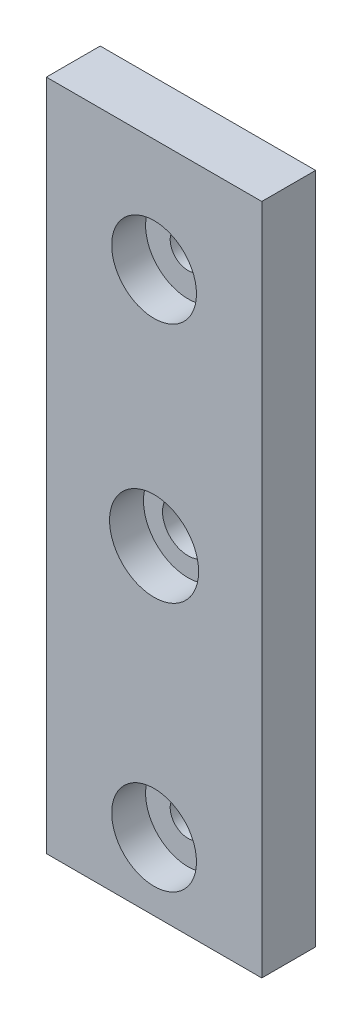
ISO-10303-21;
HEADER;
FILE_DESCRIPTION(('STEP AP214'),'2;1');
FILE_NAME('part.step','',(''),(''),'','','');
FILE_SCHEMA(('AUTOMOTIVE_DESIGN { 1 0 10303 214 1 1 1 1 }'));
ENDSEC;
DATA;
#1=APPLICATION_CONTEXT('core data for automotive mechanical design processes');
#2=APPLICATION_PROTOCOL_DEFINITION('international standard','automotive_design',2000,#1);
#3=PRODUCT_CONTEXT('',#1,'mechanical');
#4=PRODUCT('Part','Part','',(#3));
#5=PRODUCT_RELATED_PRODUCT_CATEGORY('part','',(#4));
#6=PRODUCT_DEFINITION_FORMATION('','',#4);
#7=PRODUCT_DEFINITION_CONTEXT('part definition',#1,'design');
#8=PRODUCT_DEFINITION('design','',#6,#7);
#9=PRODUCT_DEFINITION_SHAPE('','',#8);
#10=(LENGTH_UNIT() NAMED_UNIT(*) SI_UNIT(.MILLI.,.METRE.));
#11=(NAMED_UNIT(*) PLANE_ANGLE_UNIT() SI_UNIT($,.RADIAN.));
#12=(NAMED_UNIT(*) SI_UNIT($,.STERADIAN.) SOLID_ANGLE_UNIT());
#13=UNCERTAINTY_MEASURE_WITH_UNIT(LENGTH_MEASURE(1.E-05),#10,'distance_accuracy_value','');
#14=(GEOMETRIC_REPRESENTATION_CONTEXT(3) GLOBAL_UNCERTAINTY_ASSIGNED_CONTEXT((#13)) GLOBAL_UNIT_ASSIGNED_CONTEXT((#10,
#11,#12)) REPRESENTATION_CONTEXT('',''));
#15=CARTESIAN_POINT('',(0.,0.,0.));
#16=DIRECTION('',(0.,0.,1.));
#17=DIRECTION('',(1.,0.,0.));
#18=AXIS2_PLACEMENT_3D('',#15,#16,#17);
#19=CARTESIAN_POINT('',(32.4561419954302,53.471,-3.23368859390726));
#20=DIRECTION('',(0.,0.,1.));
#21=DIRECTION('',(1.,0.,0.));
#22=AXIS2_PLACEMENT_3D('',#19,#20,#21);
#23=CYLINDRICAL_SURFACE('',#22,5.25);
#24=CARTESIAN_POINT('',(32.4561419954302,53.471,3.11631140609274));
#25=DIRECTION('',(0.,0.,1.));
#26=DIRECTION('',(1.,0.,0.));
#27=AXIS2_PLACEMENT_3D('',#24,#25,#26);
#28=CIRCLE('',#27,5.25);
#29=CARTESIAN_POINT('',(37.7061419954302,53.471,3.11631140609274));
#30=VERTEX_POINT('',#29);
#31=EDGE_CURVE('E193',#30,#30,#28,.T.);
#32=ORIENTED_EDGE('',*,*,#31,.T.);
#33=EDGE_LOOP('',(#32));
#34=FACE_BOUND('',#33,.T.);
#35=CARTESIAN_POINT('',(32.4561419954302,53.471,-0.883688593907255));
#36=DIRECTION('',(0.,0.,-1.));
#37=DIRECTION('',(-1.,0.,0.));
#38=AXIS2_PLACEMENT_3D('',#35,#36,#37);
#39=CIRCLE('',#38,5.25);
#40=CARTESIAN_POINT('',(27.2061419954302,53.471,-0.883688593907255));
#41=VERTEX_POINT('',#40);
#42=EDGE_CURVE('E11',#41,#41,#39,.F.);
#43=ORIENTED_EDGE('',*,*,#42,.F.);
#44=EDGE_LOOP('',(#43));
#45=FACE_BOUND('',#44,.T.);
#46=ADVANCED_FACE('F41',(#34,#45),#23,.F.);
#47=CARTESIAN_POINT('',(19.7561419954302,100.,3.11631140609274));
#48=DIRECTION('',(0.,0.,-1.));
#49=DIRECTION('',(-1.,0.,0.));
#50=AXIS2_PLACEMENT_3D('',#47,#48,#49);
#51=PLANE('',#50);
#52=CARTESIAN_POINT('',(32.4561419954302,81.7,3.11631140609274));
#53=DIRECTION('',(0.,0.,1.));
#54=DIRECTION('',(1.,0.,0.));
#55=AXIS2_PLACEMENT_3D('',#52,#53,#54);
#56=CIRCLE('',#55,5.);
#57=CARTESIAN_POINT('',(37.4561419954302,81.7,3.11631140609274));
#58=VERTEX_POINT('',#57);
#59=EDGE_CURVE('E116',#58,#58,#56,.T.);
#60=ORIENTED_EDGE('',*,*,#59,.F.);
#61=EDGE_LOOP('',(#60));
#62=FACE_BOUND('',#61,.T.);
#63=CARTESIAN_POINT('',(32.4561419954302,23.71,3.11631140609274));
#64=DIRECTION('',(0.,0.,1.));
#65=DIRECTION('',(1.,0.,0.));
#66=AXIS2_PLACEMENT_3D('',#63,#64,#65);
#67=CIRCLE('',#66,5.);
#68=CARTESIAN_POINT('',(37.4561419954302,23.71,3.11631140609274));
#69=VERTEX_POINT('',#68);
#70=EDGE_CURVE('E124',#69,#69,#67,.T.);
#71=ORIENTED_EDGE('',*,*,#70,.F.);
#72=EDGE_LOOP('',(#71));
#73=FACE_BOUND('',#72,.T.);
#74=ORIENTED_EDGE('',*,*,#31,.F.);
#75=EDGE_LOOP('',(#74));
#76=FACE_BOUND('',#75,.T.);
#77=DIRECTION('',(-1.,0.,0.));
#78=VECTOR('',#77,1.);
#79=CARTESIAN_POINT('',(19.7561419954302,15.7,3.11631140609274));
#80=LINE('',#79,#78);
#81=CARTESIAN_POINT('',(45.1561419954302,15.7,3.11631140609274));
#82=VERTEX_POINT('',#81);
#83=CARTESIAN_POINT('',(19.7561419954302,15.7,3.11631140609274));
#84=VERTEX_POINT('',#83);
#85=EDGE_CURVE('E89',#82,#84,#80,.T.);
#86=ORIENTED_EDGE('',*,*,#85,.F.);
#87=DIRECTION('',(0.,-1.,0.));
#88=VECTOR('',#87,1.);
#89=CARTESIAN_POINT('',(45.1561419954302,100.,3.11631140609274));
#90=LINE('',#89,#88);
#91=CARTESIAN_POINT('',(45.1561419954302,95.,3.11631140609274));
#92=VERTEX_POINT('',#91);
#93=EDGE_CURVE('E98',#92,#82,#90,.T.);
#94=ORIENTED_EDGE('',*,*,#93,.F.);
#95=DIRECTION('',(1.,0.,0.));
#96=VECTOR('',#95,1.);
#97=CARTESIAN_POINT('',(19.7561419954302,95.,3.11631140609274));
#98=LINE('',#97,#96);
#99=CARTESIAN_POINT('',(19.7561419954302,95.,3.11631140609274));
#100=VERTEX_POINT('',#99);
#101=EDGE_CURVE('E210',#100,#92,#98,.T.);
#102=ORIENTED_EDGE('',*,*,#101,.F.);
#103=DIRECTION('',(0.,-1.,0.));
#104=VECTOR('',#103,1.);
#105=CARTESIAN_POINT('',(19.7561419954302,100.,3.11631140609274));
#106=LINE('',#105,#104);
#107=EDGE_CURVE('E47',#100,#84,#106,.T.);
#108=ORIENTED_EDGE('',*,*,#107,.T.);
#109=EDGE_LOOP('',(#86,#94,#102,#108));
#110=FACE_BOUND('',#109,.T.);
#111=ADVANCED_FACE('F157',(#62,#73,#76,#110),#51,.F.);
#112=CARTESIAN_POINT('',(45.1561419954302,100.,3.11631140609274));
#113=DIRECTION('',(-1.,0.,0.));
#114=DIRECTION('',(0.,0.,1.));
#115=AXIS2_PLACEMENT_3D('',#112,#113,#114);
#116=PLANE('',#115);
#117=DIRECTION('',(0.,0.,1.));
#118=VECTOR('',#117,1.);
#119=CARTESIAN_POINT('',(45.1561419954302,15.7,-3.23368859390726));
#120=LINE('',#119,#118);
#121=CARTESIAN_POINT('',(45.1561419954302,15.7,-3.23368859390726));
#122=VERTEX_POINT('',#121);
#123=EDGE_CURVE('E85',#122,#82,#120,.T.);
#124=ORIENTED_EDGE('',*,*,#123,.F.);
#125=DIRECTION('',(0.,-1.,0.));
#126=VECTOR('',#125,1.);
#127=CARTESIAN_POINT('',(45.1561419954302,100.,-3.23368859390726));
#128=LINE('',#127,#126);
#129=CARTESIAN_POINT('',(45.1561419954302,95.,-3.23368859390726));
#130=VERTEX_POINT('',#129);
#131=EDGE_CURVE('E91',#130,#122,#128,.T.);
#132=ORIENTED_EDGE('',*,*,#131,.F.);
#133=DIRECTION('',(0.,0.,1.));
#134=VECTOR('',#133,1.);
#135=CARTESIAN_POINT('',(45.1561419954302,95.,-3.23368859390726));
#136=LINE('',#135,#134);
#137=EDGE_CURVE('E61',#130,#92,#136,.T.);
#138=ORIENTED_EDGE('',*,*,#137,.T.);
#139=ORIENTED_EDGE('',*,*,#93,.T.);
#140=EDGE_LOOP('',(#124,#132,#138,#139));
#141=FACE_BOUND('',#140,.T.);
#142=ADVANCED_FACE('F95',(#141),#116,.F.);
#143=CARTESIAN_POINT('',(19.7561419954302,100.,3.11631140609274));
#144=DIRECTION('',(1.,0.,0.));
#145=DIRECTION('',(0.,0.,-1.));
#146=AXIS2_PLACEMENT_3D('',#143,#144,#145);
#147=PLANE('',#146);
#148=DIRECTION('',(0.,-1.,0.));
#149=VECTOR('',#148,1.);
#150=CARTESIAN_POINT('',(19.7561419954302,100.,-3.23368859390726));
#151=LINE('',#150,#149);
#152=CARTESIAN_POINT('',(19.7561419954302,95.,-3.23368859390726));
#153=VERTEX_POINT('',#152);
#154=CARTESIAN_POINT('',(19.7561419954302,15.7,-3.23368859390726));
#155=VERTEX_POINT('',#154);
#156=EDGE_CURVE('E103',#153,#155,#151,.T.);
#157=ORIENTED_EDGE('',*,*,#156,.T.);
#158=DIRECTION('',(0.,0.,1.));
#159=VECTOR('',#158,1.);
#160=CARTESIAN_POINT('',(19.7561419954302,15.7,-3.23368859390726));
#161=LINE('',#160,#159);
#162=EDGE_CURVE('E57',#155,#84,#161,.T.);
#163=ORIENTED_EDGE('',*,*,#162,.T.);
#164=ORIENTED_EDGE('',*,*,#107,.F.);
#165=DIRECTION('',(0.,0.,1.));
#166=VECTOR('',#165,1.);
#167=CARTESIAN_POINT('',(19.7561419954302,95.,-3.23368859390726));
#168=LINE('',#167,#166);
#169=EDGE_CURVE('E128',#153,#100,#168,.T.);
#170=ORIENTED_EDGE('',*,*,#169,.F.);
#171=EDGE_LOOP('',(#157,#163,#164,#170));
#172=FACE_BOUND('',#171,.T.);
#173=ADVANCED_FACE('F43',(#172),#147,.F.);
#174=CARTESIAN_POINT('',(32.4561419954302,23.71,-3.23368859390726));
#175=DIRECTION('',(0.,0.,1.));
#176=DIRECTION('',(1.,0.,0.));
#177=AXIS2_PLACEMENT_3D('',#174,#175,#176);
#178=CYLINDRICAL_SURFACE('',#177,2.1);
#179=CARTESIAN_POINT('',(32.4561419954302,23.71,-3.23368859390726));
#180=DIRECTION('',(0.,0.,1.));
#181=DIRECTION('',(1.,0.,0.));
#182=AXIS2_PLACEMENT_3D('',#179,#180,#181);
#183=CIRCLE('',#182,2.1);
#184=CARTESIAN_POINT('',(34.5561419954302,23.71,-3.23368859390726));
#185=VERTEX_POINT('',#184);
#186=EDGE_CURVE('E115',#185,#185,#183,.T.);
#187=ORIENTED_EDGE('',*,*,#186,.F.);
#188=EDGE_LOOP('',(#187));
#189=FACE_BOUND('',#188,.T.);
#190=CARTESIAN_POINT('',(32.4561419954302,23.71,-0.883688593907256));
#191=DIRECTION('',(0.,0.,1.));
#192=DIRECTION('',(1.,0.,0.));
#193=AXIS2_PLACEMENT_3D('',#190,#191,#192);
#194=CIRCLE('',#193,2.1);
#195=CARTESIAN_POINT('',(34.5561419954302,23.71,-0.883688593907256));
#196=VERTEX_POINT('',#195);
#197=EDGE_CURVE('E112',#196,#196,#194,.F.);
#198=ORIENTED_EDGE('',*,*,#197,.F.);
#199=EDGE_LOOP('',(#198));
#200=FACE_BOUND('',#199,.T.);
#201=ADVANCED_FACE('F138',(#189,#200),#178,.F.);
#202=CARTESIAN_POINT('',(32.4561419954302,81.7,-3.23368859390726));
#203=DIRECTION('',(0.,0.,1.));
#204=DIRECTION('',(1.,0.,0.));
#205=AXIS2_PLACEMENT_3D('',#202,#203,#204);
#206=CYLINDRICAL_SURFACE('',#205,2.1);
#207=CARTESIAN_POINT('',(32.4561419954302,81.7,-3.23368859390726));
#208=DIRECTION('',(0.,0.,1.));
#209=DIRECTION('',(1.,0.,0.));
#210=AXIS2_PLACEMENT_3D('',#207,#208,#209);
#211=CIRCLE('',#210,2.1);
#212=CARTESIAN_POINT('',(34.5561419954302,81.7,-3.23368859390726));
#213=VERTEX_POINT('',#212);
#214=EDGE_CURVE('E104',#213,#213,#211,.T.);
#215=ORIENTED_EDGE('',*,*,#214,.F.);
#216=EDGE_LOOP('',(#215));
#217=FACE_BOUND('',#216,.T.);
#218=CARTESIAN_POINT('',(32.4561419954302,81.7,-0.883688593907256));
#219=DIRECTION('',(0.,0.,1.));
#220=DIRECTION('',(1.,0.,0.));
#221=AXIS2_PLACEMENT_3D('',#218,#219,#220);
#222=CIRCLE('',#221,2.1);
#223=CARTESIAN_POINT('',(34.5561419954302,81.7,-0.883688593907256));
#224=VERTEX_POINT('',#223);
#225=EDGE_CURVE('E109',#224,#224,#222,.F.);
#226=ORIENTED_EDGE('',*,*,#225,.F.);
#227=EDGE_LOOP('',(#226));
#228=FACE_BOUND('',#227,.T.);
#229=ADVANCED_FACE('F141',(#217,#228),#206,.F.);
#230=CARTESIAN_POINT('',(19.7561419954302,100.,-3.23368859390726));
#231=DIRECTION('',(0.,0.,1.));
#232=DIRECTION('',(1.,0.,0.));
#233=AXIS2_PLACEMENT_3D('',#230,#231,#232);
#234=PLANE('',#233);
#235=ORIENTED_EDGE('',*,*,#214,.T.);
#236=EDGE_LOOP('',(#235));
#237=FACE_BOUND('',#236,.T.);
#238=ORIENTED_EDGE('',*,*,#186,.T.);
#239=EDGE_LOOP('',(#238));
#240=FACE_BOUND('',#239,.T.);
#241=ORIENTED_EDGE('',*,*,#131,.T.);
#242=DIRECTION('',(-1.,0.,0.));
#243=VECTOR('',#242,1.);
#244=CARTESIAN_POINT('',(19.7561419954302,15.7,-3.23368859390726));
#245=LINE('',#244,#243);
#246=EDGE_CURVE('E79',#122,#155,#245,.T.);
#247=ORIENTED_EDGE('',*,*,#246,.T.);
#248=ORIENTED_EDGE('',*,*,#156,.F.);
#249=DIRECTION('',(1.,0.,0.));
#250=VECTOR('',#249,1.);
#251=CARTESIAN_POINT('',(19.7561419954302,95.,-3.23368859390726));
#252=LINE('',#251,#250);
#253=EDGE_CURVE('E99',#153,#130,#252,.T.);
#254=ORIENTED_EDGE('',*,*,#253,.T.);
#255=EDGE_LOOP('',(#241,#247,#248,#254));
#256=FACE_BOUND('',#255,.T.);
#257=CARTESIAN_POINT('',(32.4561419954302,53.471,-3.23368859390726));
#258=DIRECTION('',(0.,0.,-1.));
#259=DIRECTION('',(-1.,0.,0.));
#260=AXIS2_PLACEMENT_3D('',#257,#258,#259);
#261=CIRCLE('',#260,3.);
#262=CARTESIAN_POINT('',(29.4561419954302,53.471,-3.23368859390726));
#263=VERTEX_POINT('',#262);
#264=EDGE_CURVE('E202',#263,#263,#261,.T.);
#265=ORIENTED_EDGE('',*,*,#264,.F.);
#266=EDGE_LOOP('',(#265));
#267=FACE_BOUND('',#266,.T.);
#268=ADVANCED_FACE('F96',(#237,#240,#256,#267),#234,.F.);
#269=CARTESIAN_POINT('',(32.4561419954302,81.7,-0.883688593907256));
#270=DIRECTION('',(0.,0.,1.));
#271=DIRECTION('',(1.,0.,0.));
#272=AXIS2_PLACEMENT_3D('',#269,#270,#271);
#273=PLANE('',#272);
#274=CARTESIAN_POINT('',(32.4561419954302,81.7,-0.883688593907256));
#275=DIRECTION('',(0.,0.,1.));
#276=DIRECTION('',(1.,0.,0.));
#277=AXIS2_PLACEMENT_3D('',#274,#275,#276);
#278=CIRCLE('',#277,5.);
#279=CARTESIAN_POINT('',(37.4561419954302,81.7,-0.883688593907256));
#280=VERTEX_POINT('',#279);
#281=EDGE_CURVE('E113',#280,#280,#278,.T.);
#282=ORIENTED_EDGE('',*,*,#281,.T.);
#283=EDGE_LOOP('',(#282));
#284=FACE_BOUND('',#283,.T.);
#285=ORIENTED_EDGE('',*,*,#225,.T.);
#286=EDGE_LOOP('',(#285));
#287=FACE_BOUND('',#286,.T.);
#288=ADVANCED_FACE('F179',(#284,#287),#273,.T.);
#289=CARTESIAN_POINT('',(32.4561419954302,81.7,-0.883688593907256));
#290=DIRECTION('',(0.,0.,1.));
#291=DIRECTION('',(1.,0.,0.));
#292=AXIS2_PLACEMENT_3D('',#289,#290,#291);
#293=CYLINDRICAL_SURFACE('',#292,5.);
#294=ORIENTED_EDGE('',*,*,#281,.F.);
#295=EDGE_LOOP('',(#294));
#296=FACE_BOUND('',#295,.T.);
#297=ORIENTED_EDGE('',*,*,#59,.T.);
#298=EDGE_LOOP('',(#297));
#299=FACE_BOUND('',#298,.T.);
#300=ADVANCED_FACE('F176',(#296,#299),#293,.F.);
#301=CARTESIAN_POINT('',(32.4561419954302,23.71,-0.883688593907256));
#302=DIRECTION('',(0.,0.,1.));
#303=DIRECTION('',(1.,0.,0.));
#304=AXIS2_PLACEMENT_3D('',#301,#302,#303);
#305=PLANE('',#304);
#306=CARTESIAN_POINT('',(32.4561419954302,23.71,-0.883688593907256));
#307=DIRECTION('',(0.,0.,1.));
#308=DIRECTION('',(1.,0.,0.));
#309=AXIS2_PLACEMENT_3D('',#306,#307,#308);
#310=CIRCLE('',#309,5.);
#311=CARTESIAN_POINT('',(37.4561419954302,23.71,-0.883688593907256));
#312=VERTEX_POINT('',#311);
#313=EDGE_CURVE('E120',#312,#312,#310,.T.);
#314=ORIENTED_EDGE('',*,*,#313,.T.);
#315=EDGE_LOOP('',(#314));
#316=FACE_BOUND('',#315,.T.);
#317=ORIENTED_EDGE('',*,*,#197,.T.);
#318=EDGE_LOOP('',(#317));
#319=FACE_BOUND('',#318,.T.);
#320=ADVANCED_FACE('F172',(#316,#319),#305,.T.);
#321=CARTESIAN_POINT('',(32.4561419954302,23.71,-0.883688593907256));
#322=DIRECTION('',(0.,0.,1.));
#323=DIRECTION('',(1.,0.,0.));
#324=AXIS2_PLACEMENT_3D('',#321,#322,#323);
#325=CYLINDRICAL_SURFACE('',#324,5.);
#326=ORIENTED_EDGE('',*,*,#313,.F.);
#327=EDGE_LOOP('',(#326));
#328=FACE_BOUND('',#327,.T.);
#329=ORIENTED_EDGE('',*,*,#70,.T.);
#330=EDGE_LOOP('',(#329));
#331=FACE_BOUND('',#330,.T.);
#332=ADVANCED_FACE('F173',(#328,#331),#325,.F.);
#333=CARTESIAN_POINT('',(19.7561419954302,95.,-3.23368859390726));
#334=DIRECTION('',(0.,-1.,0.));
#335=DIRECTION('',(0.,0.,-1.));
#336=AXIS2_PLACEMENT_3D('',#333,#334,#335);
#337=PLANE('',#336);
#338=ORIENTED_EDGE('',*,*,#101,.T.);
#339=ORIENTED_EDGE('',*,*,#137,.F.);
#340=ORIENTED_EDGE('',*,*,#253,.F.);
#341=ORIENTED_EDGE('',*,*,#169,.T.);
#342=EDGE_LOOP('',(#338,#339,#340,#341));
#343=FACE_BOUND('',#342,.T.);
#344=ADVANCED_FACE('F167',(#343),#337,.F.);
#345=CARTESIAN_POINT('',(19.7561419954302,15.7,-3.23368859390726));
#346=DIRECTION('',(0.,1.,0.));
#347=DIRECTION('',(0.,0.,1.));
#348=AXIS2_PLACEMENT_3D('',#345,#346,#347);
#349=PLANE('',#348);
#350=ORIENTED_EDGE('',*,*,#85,.T.);
#351=ORIENTED_EDGE('',*,*,#162,.F.);
#352=ORIENTED_EDGE('',*,*,#246,.F.);
#353=ORIENTED_EDGE('',*,*,#123,.T.);
#354=EDGE_LOOP('',(#350,#351,#352,#353));
#355=FACE_BOUND('',#354,.T.);
#356=ADVANCED_FACE('F82',(#355),#349,.F.);
#357=CARTESIAN_POINT('',(32.4561419954302,53.471,-0.883688593907255));
#358=DIRECTION('',(0.,0.,-1.));
#359=DIRECTION('',(-1.,0.,0.));
#360=AXIS2_PLACEMENT_3D('',#357,#358,#359);
#361=PLANE('',#360);
#362=CARTESIAN_POINT('',(32.4561419954302,53.471,-0.883688593907255));
#363=DIRECTION('',(0.,0.,-1.));
#364=DIRECTION('',(-1.,0.,0.));
#365=AXIS2_PLACEMENT_3D('',#362,#363,#364);
#366=CIRCLE('',#365,3.);
#367=CARTESIAN_POINT('',(29.4561419954302,53.471,-0.883688593907255));
#368=VERTEX_POINT('',#367);
#369=EDGE_CURVE('E199',#368,#368,#366,.T.);
#370=ORIENTED_EDGE('',*,*,#369,.T.);
#371=EDGE_LOOP('',(#370));
#372=FACE_BOUND('',#371,.T.);
#373=ORIENTED_EDGE('',*,*,#42,.T.);
#374=EDGE_LOOP('',(#373));
#375=FACE_BOUND('',#374,.T.);
#376=ADVANCED_FACE('F240',(#372,#375),#361,.F.);
#377=CARTESIAN_POINT('',(32.4561419954302,53.471,-0.883688593907255));
#378=DIRECTION('',(0.,0.,-1.));
#379=DIRECTION('',(-1.,0.,0.));
#380=AXIS2_PLACEMENT_3D('',#377,#378,#379);
#381=CYLINDRICAL_SURFACE('',#380,3.);
#382=ORIENTED_EDGE('',*,*,#369,.F.);
#383=EDGE_LOOP('',(#382));
#384=FACE_BOUND('',#383,.T.);
#385=ORIENTED_EDGE('',*,*,#264,.T.);
#386=EDGE_LOOP('',(#385));
#387=FACE_BOUND('',#386,.T.);
#388=ADVANCED_FACE('F214',(#384,#387),#381,.F.);
#389=CLOSED_SHELL('',(#46,#111,#142,#173,#201,#229,#268,#288,#300,#320,#332,#344,#356,#376,#388));
#390=MANIFOLD_SOLID_BREP('B2',#389);
#391=ADVANCED_BREP_SHAPE_REPRESENTATION('',(#18,#390),#14);
#392=SHAPE_DEFINITION_REPRESENTATION(#9,#391);
ENDSEC;
END-ISO-10303-21;
